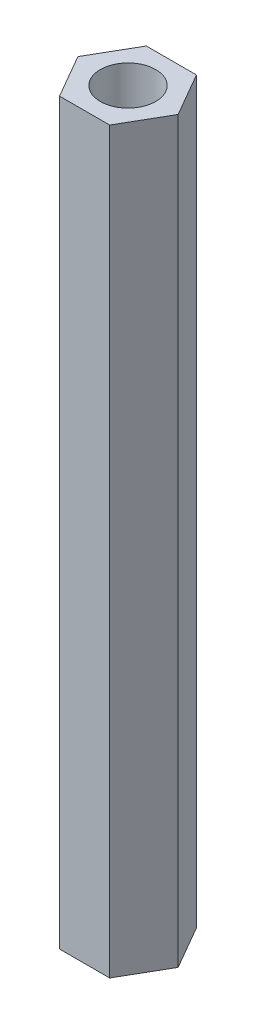
ISO-10303-21;
HEADER;
FILE_DESCRIPTION(('STEP AP214'),'2;1');
FILE_NAME('part.step','',(''),(''),'','','');
FILE_SCHEMA(('AUTOMOTIVE_DESIGN { 1 0 10303 214 1 1 1 1 }'));
ENDSEC;
DATA;
#1=APPLICATION_CONTEXT('core data for automotive mechanical design processes');
#2=APPLICATION_PROTOCOL_DEFINITION('international standard','automotive_design',2000,#1);
#3=PRODUCT_CONTEXT('',#1,'mechanical');
#4=PRODUCT('Part','Part','',(#3));
#5=PRODUCT_RELATED_PRODUCT_CATEGORY('part','',(#4));
#6=PRODUCT_DEFINITION_FORMATION('','',#4);
#7=PRODUCT_DEFINITION_CONTEXT('part definition',#1,'design');
#8=PRODUCT_DEFINITION('design','',#6,#7);
#9=PRODUCT_DEFINITION_SHAPE('','',#8);
#10=(LENGTH_UNIT() NAMED_UNIT(*) SI_UNIT(.MILLI.,.METRE.));
#11=(NAMED_UNIT(*) PLANE_ANGLE_UNIT() SI_UNIT($,.RADIAN.));
#12=(NAMED_UNIT(*) SI_UNIT($,.STERADIAN.) SOLID_ANGLE_UNIT());
#13=UNCERTAINTY_MEASURE_WITH_UNIT(LENGTH_MEASURE(1.E-05),#10,'distance_accuracy_value','');
#14=(GEOMETRIC_REPRESENTATION_CONTEXT(3) GLOBAL_UNCERTAINTY_ASSIGNED_CONTEXT((#13)) GLOBAL_UNIT_ASSIGNED_CONTEXT((#10,
#11,#12)) REPRESENTATION_CONTEXT('',''));
#15=CARTESIAN_POINT('',(0.,0.,0.));
#16=DIRECTION('',(0.,0.,1.));
#17=DIRECTION('',(1.,0.,0.));
#18=AXIS2_PLACEMENT_3D('',#15,#16,#17);
#19=CARTESIAN_POINT('',(0.,40.,0.));
#20=DIRECTION('',(0.,1.,0.));
#21=DIRECTION('',(0.,0.,1.));
#22=AXIS2_PLACEMENT_3D('',#19,#20,#21);
#23=PLANE('',#22);
#24=DIRECTION('',(0.5,0.,-0.866025403784439));
#25=VECTOR('',#24,1.);
#26=CARTESIAN_POINT('',(1.35677313259562,40.,2.35));
#27=LINE('',#26,#25);
#28=CARTESIAN_POINT('',(1.35677313259562,40.,2.35));
#29=VERTEX_POINT('',#28);
#30=CARTESIAN_POINT('',(2.71354626519124,40.,0.));
#31=VERTEX_POINT('',#30);
#32=EDGE_CURVE('E130',#29,#31,#27,.T.);
#33=ORIENTED_EDGE('',*,*,#32,.T.);
#34=DIRECTION('',(-0.5,0.,-0.866025403784439));
#35=VECTOR('',#34,1.);
#36=CARTESIAN_POINT('',(2.71354626519124,40.,0.));
#37=LINE('',#36,#35);
#38=CARTESIAN_POINT('',(1.35677313259562,40.,-2.35));
#39=VERTEX_POINT('',#38);
#40=EDGE_CURVE('E88',#31,#39,#37,.T.);
#41=ORIENTED_EDGE('',*,*,#40,.T.);
#42=DIRECTION('',(-1.,0.,0.));
#43=VECTOR('',#42,1.);
#44=CARTESIAN_POINT('',(1.35677313259562,40.,-2.35));
#45=LINE('',#44,#43);
#46=CARTESIAN_POINT('',(-1.35677313259562,40.,-2.35));
#47=VERTEX_POINT('',#46);
#48=EDGE_CURVE('E101',#39,#47,#45,.T.);
#49=ORIENTED_EDGE('',*,*,#48,.T.);
#50=DIRECTION('',(-0.5,0.,0.866025403784439));
#51=VECTOR('',#50,1.);
#52=CARTESIAN_POINT('',(-1.35677313259562,40.,-2.35));
#53=LINE('',#52,#51);
#54=CARTESIAN_POINT('',(-2.71354626519124,40.,0.));
#55=VERTEX_POINT('',#54);
#56=EDGE_CURVE('E95',#47,#55,#53,.T.);
#57=ORIENTED_EDGE('',*,*,#56,.T.);
#58=DIRECTION('',(0.5,0.,0.866025403784439));
#59=VECTOR('',#58,1.);
#60=CARTESIAN_POINT('',(-2.71354626519124,40.,0.));
#61=LINE('',#60,#59);
#62=CARTESIAN_POINT('',(-1.35677313259562,40.,2.35));
#63=VERTEX_POINT('',#62);
#64=EDGE_CURVE('E99',#55,#63,#61,.T.);
#65=ORIENTED_EDGE('',*,*,#64,.T.);
#66=DIRECTION('',(1.,0.,0.));
#67=VECTOR('',#66,1.);
#68=CARTESIAN_POINT('',(-1.35677313259562,40.,2.35));
#69=LINE('',#68,#67);
#70=EDGE_CURVE('E51',#63,#29,#69,.T.);
#71=ORIENTED_EDGE('',*,*,#70,.T.);
#72=EDGE_LOOP('',(#33,#41,#49,#57,#65,#71));
#73=FACE_BOUND('',#72,.T.);
#74=CARTESIAN_POINT('',(0.,40.,0.));
#75=DIRECTION('',(0.,1.,0.));
#76=DIRECTION('',(0.,0.,1.));
#77=AXIS2_PLACEMENT_3D('',#74,#75,#76);
#78=CIRCLE('',#77,1.5);
#79=CARTESIAN_POINT('',(0.,40.,1.5));
#80=VERTEX_POINT('',#79);
#81=EDGE_CURVE('E123',#80,#80,#78,.T.);
#82=ORIENTED_EDGE('',*,*,#81,.F.);
#83=EDGE_LOOP('',(#82));
#84=FACE_BOUND('',#83,.T.);
#85=ADVANCED_FACE('F34',(#73,#84),#23,.T.);
#86=CARTESIAN_POINT('',(0.,0.,0.));
#87=DIRECTION('',(0.,1.,0.));
#88=DIRECTION('',(0.,0.,1.));
#89=AXIS2_PLACEMENT_3D('',#86,#87,#88);
#90=PLANE('',#89);
#91=DIRECTION('',(0.5,0.,-0.866025403784439));
#92=VECTOR('',#91,1.);
#93=CARTESIAN_POINT('',(1.35677313259562,0.,2.35));
#94=LINE('',#93,#92);
#95=CARTESIAN_POINT('',(1.35677313259562,0.,2.35));
#96=VERTEX_POINT('',#95);
#97=CARTESIAN_POINT('',(2.71354626519124,0.,0.));
#98=VERTEX_POINT('',#97);
#99=EDGE_CURVE('E119',#96,#98,#94,.T.);
#100=ORIENTED_EDGE('',*,*,#99,.F.);
#101=DIRECTION('',(1.,0.,0.));
#102=VECTOR('',#101,1.);
#103=CARTESIAN_POINT('',(-1.35677313259562,0.,2.35));
#104=LINE('',#103,#102);
#105=CARTESIAN_POINT('',(-1.35677313259562,0.,2.35));
#106=VERTEX_POINT('',#105);
#107=EDGE_CURVE('E80',#106,#96,#104,.T.);
#108=ORIENTED_EDGE('',*,*,#107,.F.);
#109=DIRECTION('',(0.5,0.,0.866025403784439));
#110=VECTOR('',#109,1.);
#111=CARTESIAN_POINT('',(-2.71354626519124,0.,0.));
#112=LINE('',#111,#110);
#113=CARTESIAN_POINT('',(-2.71354626519124,0.,0.));
#114=VERTEX_POINT('',#113);
#115=EDGE_CURVE('E74',#114,#106,#112,.T.);
#116=ORIENTED_EDGE('',*,*,#115,.F.);
#117=DIRECTION('',(-0.5,0.,0.866025403784439));
#118=VECTOR('',#117,1.);
#119=CARTESIAN_POINT('',(-1.35677313259562,0.,-2.35));
#120=LINE('',#119,#118);
#121=CARTESIAN_POINT('',(-1.35677313259562,0.,-2.35));
#122=VERTEX_POINT('',#121);
#123=EDGE_CURVE('E109',#122,#114,#120,.T.);
#124=ORIENTED_EDGE('',*,*,#123,.F.);
#125=DIRECTION('',(-1.,0.,0.));
#126=VECTOR('',#125,1.);
#127=CARTESIAN_POINT('',(1.35677313259562,0.,-2.35));
#128=LINE('',#127,#126);
#129=CARTESIAN_POINT('',(1.35677313259562,0.,-2.35));
#130=VERTEX_POINT('',#129);
#131=EDGE_CURVE('E125',#130,#122,#128,.T.);
#132=ORIENTED_EDGE('',*,*,#131,.F.);
#133=DIRECTION('',(-0.5,0.,-0.866025403784439));
#134=VECTOR('',#133,1.);
#135=CARTESIAN_POINT('',(2.71354626519124,0.,0.));
#136=LINE('',#135,#134);
#137=EDGE_CURVE('E122',#98,#130,#136,.T.);
#138=ORIENTED_EDGE('',*,*,#137,.F.);
#139=EDGE_LOOP('',(#100,#108,#116,#124,#132,#138));
#140=FACE_BOUND('',#139,.T.);
#141=CARTESIAN_POINT('',(0.,0.,0.));
#142=DIRECTION('',(0.,1.,0.));
#143=DIRECTION('',(0.,0.,1.));
#144=AXIS2_PLACEMENT_3D('',#141,#142,#143);
#145=CIRCLE('',#144,1.5);
#146=CARTESIAN_POINT('',(0.,0.,1.5));
#147=VERTEX_POINT('',#146);
#148=EDGE_CURVE('E223',#147,#147,#145,.T.);
#149=ORIENTED_EDGE('',*,*,#148,.T.);
#150=EDGE_LOOP('',(#149));
#151=FACE_BOUND('',#150,.T.);
#152=ADVANCED_FACE('F139',(#140,#151),#90,.F.);
#153=CARTESIAN_POINT('',(1.35677313259562,40.,2.35));
#154=DIRECTION('',(-0.866025403784439,0.,-0.5));
#155=DIRECTION('',(-0.5,0.,0.866025403784439));
#156=AXIS2_PLACEMENT_3D('',#153,#154,#155);
#157=PLANE('',#156);
#158=ORIENTED_EDGE('',*,*,#99,.T.);
#159=DIRECTION('',(0.,-1.,0.));
#160=VECTOR('',#159,1.);
#161=CARTESIAN_POINT('',(2.71354626519124,40.,0.));
#162=LINE('',#161,#160);
#163=EDGE_CURVE('E11',#31,#98,#162,.T.);
#164=ORIENTED_EDGE('',*,*,#163,.F.);
#165=ORIENTED_EDGE('',*,*,#32,.F.);
#166=DIRECTION('',(0.,-1.,0.));
#167=VECTOR('',#166,1.);
#168=CARTESIAN_POINT('',(1.35677313259562,40.,2.35));
#169=LINE('',#168,#167);
#170=EDGE_CURVE('E115',#29,#96,#169,.T.);
#171=ORIENTED_EDGE('',*,*,#170,.T.);
#172=EDGE_LOOP('',(#158,#164,#165,#171));
#173=FACE_BOUND('',#172,.T.);
#174=ADVANCED_FACE('F36',(#173),#157,.F.);
#175=CARTESIAN_POINT('',(2.71354626519124,40.,0.));
#176=DIRECTION('',(-0.866025403784439,0.,0.5));
#177=DIRECTION('',(0.5,0.,0.866025403784439));
#178=AXIS2_PLACEMENT_3D('',#175,#176,#177);
#179=PLANE('',#178);
#180=ORIENTED_EDGE('',*,*,#137,.T.);
#181=DIRECTION('',(0.,-1.,0.));
#182=VECTOR('',#181,1.);
#183=CARTESIAN_POINT('',(1.35677313259562,40.,-2.35));
#184=LINE('',#183,#182);
#185=EDGE_CURVE('E43',#39,#130,#184,.T.);
#186=ORIENTED_EDGE('',*,*,#185,.F.);
#187=ORIENTED_EDGE('',*,*,#40,.F.);
#188=ORIENTED_EDGE('',*,*,#163,.T.);
#189=EDGE_LOOP('',(#180,#186,#187,#188));
#190=FACE_BOUND('',#189,.T.);
#191=ADVANCED_FACE('F164',(#190),#179,.F.);
#192=CARTESIAN_POINT('',(1.35677313259562,40.,-2.35));
#193=DIRECTION('',(0.,0.,1.));
#194=DIRECTION('',(1.,0.,0.));
#195=AXIS2_PLACEMENT_3D('',#192,#193,#194);
#196=PLANE('',#195);
#197=ORIENTED_EDGE('',*,*,#131,.T.);
#198=DIRECTION('',(0.,-1.,0.));
#199=VECTOR('',#198,1.);
#200=CARTESIAN_POINT('',(-1.35677313259562,40.,-2.35));
#201=LINE('',#200,#199);
#202=EDGE_CURVE('E110',#47,#122,#201,.T.);
#203=ORIENTED_EDGE('',*,*,#202,.F.);
#204=ORIENTED_EDGE('',*,*,#48,.F.);
#205=ORIENTED_EDGE('',*,*,#185,.T.);
#206=EDGE_LOOP('',(#197,#203,#204,#205));
#207=FACE_BOUND('',#206,.T.);
#208=ADVANCED_FACE('F136',(#207),#196,.F.);
#209=CARTESIAN_POINT('',(-1.35677313259562,40.,-2.35));
#210=DIRECTION('',(0.866025403784439,0.,0.5));
#211=DIRECTION('',(0.5,0.,-0.866025403784439));
#212=AXIS2_PLACEMENT_3D('',#209,#210,#211);
#213=PLANE('',#212);
#214=ORIENTED_EDGE('',*,*,#123,.T.);
#215=DIRECTION('',(0.,-1.,0.));
#216=VECTOR('',#215,1.);
#217=CARTESIAN_POINT('',(-2.71354626519124,40.,0.));
#218=LINE('',#217,#216);
#219=EDGE_CURVE('E106',#55,#114,#218,.T.);
#220=ORIENTED_EDGE('',*,*,#219,.F.);
#221=ORIENTED_EDGE('',*,*,#56,.F.);
#222=ORIENTED_EDGE('',*,*,#202,.T.);
#223=EDGE_LOOP('',(#214,#220,#221,#222));
#224=FACE_BOUND('',#223,.T.);
#225=ADVANCED_FACE('F107',(#224),#213,.F.);
#226=CARTESIAN_POINT('',(-2.71354626519124,40.,0.));
#227=DIRECTION('',(0.866025403784439,0.,-0.5));
#228=DIRECTION('',(-0.5,0.,-0.866025403784439));
#229=AXIS2_PLACEMENT_3D('',#226,#227,#228);
#230=PLANE('',#229);
#231=ORIENTED_EDGE('',*,*,#115,.T.);
#232=DIRECTION('',(0.,-1.,0.));
#233=VECTOR('',#232,1.);
#234=CARTESIAN_POINT('',(-1.35677313259562,40.,2.35));
#235=LINE('',#234,#233);
#236=EDGE_CURVE('E111',#63,#106,#235,.T.);
#237=ORIENTED_EDGE('',*,*,#236,.F.);
#238=ORIENTED_EDGE('',*,*,#64,.F.);
#239=ORIENTED_EDGE('',*,*,#219,.T.);
#240=EDGE_LOOP('',(#231,#237,#238,#239));
#241=FACE_BOUND('',#240,.T.);
#242=ADVANCED_FACE('F113',(#241),#230,.F.);
#243=CARTESIAN_POINT('',(-1.35677313259562,40.,2.35));
#244=DIRECTION('',(0.,0.,-1.));
#245=DIRECTION('',(-1.,0.,0.));
#246=AXIS2_PLACEMENT_3D('',#243,#244,#245);
#247=PLANE('',#246);
#248=ORIENTED_EDGE('',*,*,#107,.T.);
#249=ORIENTED_EDGE('',*,*,#170,.F.);
#250=ORIENTED_EDGE('',*,*,#70,.F.);
#251=ORIENTED_EDGE('',*,*,#236,.T.);
#252=EDGE_LOOP('',(#248,#249,#250,#251));
#253=FACE_BOUND('',#252,.T.);
#254=ADVANCED_FACE('F144',(#253),#247,.F.);
#255=CARTESIAN_POINT('',(0.,40.,0.));
#256=DIRECTION('',(0.,-1.,0.));
#257=DIRECTION('',(0.,0.,-1.));
#258=AXIS2_PLACEMENT_3D('',#255,#256,#257);
#259=CYLINDRICAL_SURFACE('',#258,1.5);
#260=ORIENTED_EDGE('',*,*,#81,.T.);
#261=EDGE_LOOP('',(#260));
#262=FACE_BOUND('',#261,.T.);
#263=ORIENTED_EDGE('',*,*,#148,.F.);
#264=EDGE_LOOP('',(#263));
#265=FACE_BOUND('',#264,.T.);
#266=ADVANCED_FACE('F146',(#262,#265),#259,.F.);
#267=CLOSED_SHELL('',(#85,#152,#174,#191,#208,#225,#242,#254,#266));
#268=MANIFOLD_SOLID_BREP('B2',#267);
#269=ADVANCED_BREP_SHAPE_REPRESENTATION('',(#18,#268),#14);
#270=SHAPE_DEFINITION_REPRESENTATION(#9,#269);
ENDSEC;
END-ISO-10303-21;
